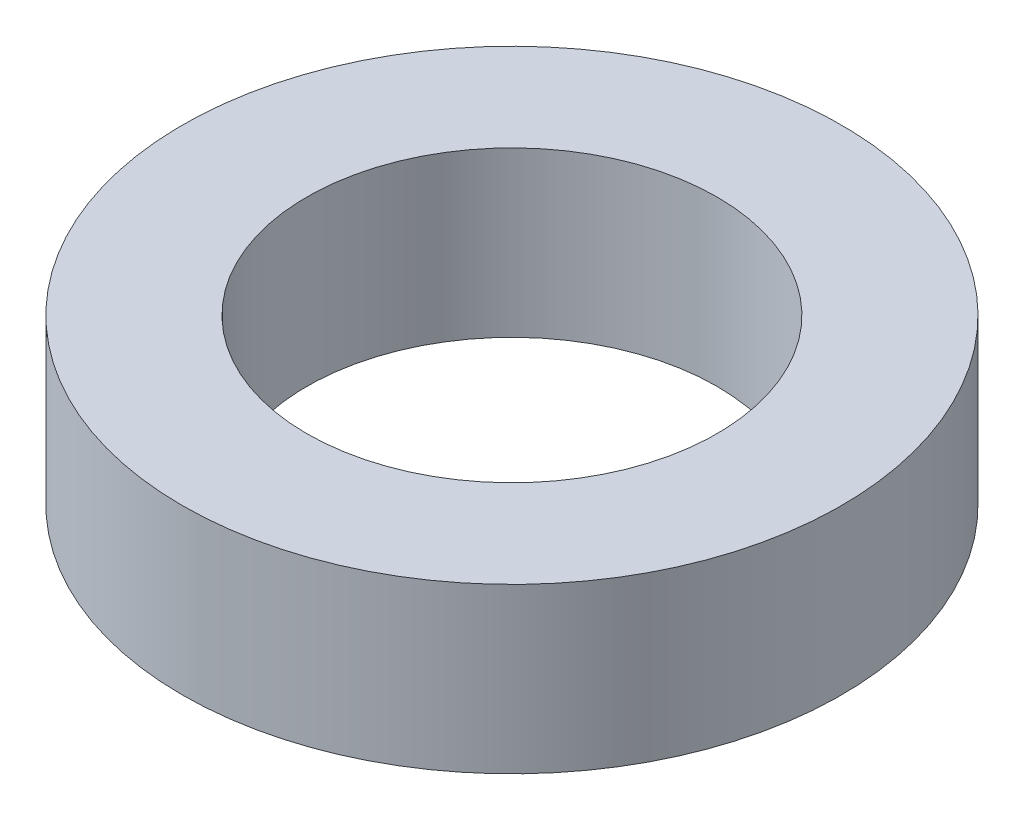
ISO-10303-21;
HEADER;
FILE_DESCRIPTION(('STEP AP214'),'2;1');
FILE_NAME('part.step','',(''),(''),'','','');
FILE_SCHEMA(('AUTOMOTIVE_DESIGN { 1 0 10303 214 1 1 1 1 }'));
ENDSEC;
DATA;
#1=APPLICATION_CONTEXT('core data for automotive mechanical design processes');
#2=APPLICATION_PROTOCOL_DEFINITION('international standard','automotive_design',2000,#1);
#3=PRODUCT_CONTEXT('',#1,'mechanical');
#4=PRODUCT('Part','Part','',(#3));
#5=PRODUCT_RELATED_PRODUCT_CATEGORY('part','',(#4));
#6=PRODUCT_DEFINITION_FORMATION('','',#4);
#7=PRODUCT_DEFINITION_CONTEXT('part definition',#1,'design');
#8=PRODUCT_DEFINITION('design','',#6,#7);
#9=PRODUCT_DEFINITION_SHAPE('','',#8);
#10=(LENGTH_UNIT() NAMED_UNIT(*) SI_UNIT(.MILLI.,.METRE.));
#11=(NAMED_UNIT(*) PLANE_ANGLE_UNIT() SI_UNIT($,.RADIAN.));
#12=(NAMED_UNIT(*) SI_UNIT($,.STERADIAN.) SOLID_ANGLE_UNIT());
#13=UNCERTAINTY_MEASURE_WITH_UNIT(LENGTH_MEASURE(1.E-05),#10,'distance_accuracy_value','');
#14=(GEOMETRIC_REPRESENTATION_CONTEXT(3) GLOBAL_UNCERTAINTY_ASSIGNED_CONTEXT((#13)) GLOBAL_UNIT_ASSIGNED_CONTEXT((#10,
#11,#12)) REPRESENTATION_CONTEXT('',''));
#15=CARTESIAN_POINT('',(0.,0.,0.));
#16=DIRECTION('',(0.,0.,1.));
#17=DIRECTION('',(1.,0.,0.));
#18=AXIS2_PLACEMENT_3D('',#15,#16,#17);
#19=CARTESIAN_POINT('',(0.,11.2,0.));
#20=DIRECTION('',(0.,1.,0.));
#21=DIRECTION('',(0.,0.,1.));
#22=AXIS2_PLACEMENT_3D('',#19,#20,#21);
#23=PLANE('',#22);
#24=CARTESIAN_POINT('',(0.,11.2,0.));
#25=DIRECTION('',(0.,1.,0.));
#26=DIRECTION('',(0.,0.,1.));
#27=AXIS2_PLACEMENT_3D('',#24,#25,#26);
#28=CIRCLE('',#27,22.5);
#29=CARTESIAN_POINT('',(0.,11.2,22.5));
#30=VERTEX_POINT('',#29);
#31=EDGE_CURVE('E10',#30,#30,#28,.T.);
#32=ORIENTED_EDGE('',*,*,#31,.T.);
#33=EDGE_LOOP('',(#32));
#34=FACE_BOUND('',#33,.T.);
#35=CARTESIAN_POINT('',(0.,11.2,0.));
#36=DIRECTION('',(0.,1.,0.));
#37=DIRECTION('',(0.,0.,1.));
#38=AXIS2_PLACEMENT_3D('',#35,#36,#37);
#39=CIRCLE('',#38,14.);
#40=CARTESIAN_POINT('',(0.,11.2,14.));
#41=VERTEX_POINT('',#40);
#42=EDGE_CURVE('E44',#41,#41,#39,.T.);
#43=ORIENTED_EDGE('',*,*,#42,.F.);
#44=EDGE_LOOP('',(#43));
#45=FACE_BOUND('',#44,.T.);
#46=ADVANCED_FACE('F33',(#34,#45),#23,.T.);
#47=CARTESIAN_POINT('',(0.,0.,0.));
#48=DIRECTION('',(0.,1.,0.));
#49=DIRECTION('',(0.,0.,1.));
#50=AXIS2_PLACEMENT_3D('',#47,#48,#49);
#51=PLANE('',#50);
#52=CARTESIAN_POINT('',(0.,0.,0.));
#53=DIRECTION('',(0.,1.,0.));
#54=DIRECTION('',(0.,0.,1.));
#55=AXIS2_PLACEMENT_3D('',#52,#53,#54);
#56=CIRCLE('',#55,22.5);
#57=CARTESIAN_POINT('',(0.,0.,22.5));
#58=VERTEX_POINT('',#57);
#59=EDGE_CURVE('E37',#58,#58,#56,.T.);
#60=ORIENTED_EDGE('',*,*,#59,.F.);
#61=EDGE_LOOP('',(#60));
#62=FACE_BOUND('',#61,.T.);
#63=CARTESIAN_POINT('',(0.,0.,0.));
#64=DIRECTION('',(0.,1.,0.));
#65=DIRECTION('',(0.,0.,1.));
#66=AXIS2_PLACEMENT_3D('',#63,#64,#65);
#67=CIRCLE('',#66,14.);
#68=CARTESIAN_POINT('',(0.,0.,14.));
#69=VERTEX_POINT('',#68);
#70=EDGE_CURVE('E46',#69,#69,#67,.T.);
#71=ORIENTED_EDGE('',*,*,#70,.T.);
#72=EDGE_LOOP('',(#71));
#73=FACE_BOUND('',#72,.T.);
#74=ADVANCED_FACE('F56',(#62,#73),#51,.F.);
#75=CARTESIAN_POINT('',(0.,11.2,0.));
#76=DIRECTION('',(0.,-1.,0.));
#77=DIRECTION('',(0.,0.,-1.));
#78=AXIS2_PLACEMENT_3D('',#75,#76,#77);
#79=CYLINDRICAL_SURFACE('',#78,22.5);
#80=ORIENTED_EDGE('',*,*,#31,.F.);
#81=EDGE_LOOP('',(#80));
#82=FACE_BOUND('',#81,.T.);
#83=ORIENTED_EDGE('',*,*,#59,.T.);
#84=EDGE_LOOP('',(#83));
#85=FACE_BOUND('',#84,.T.);
#86=ADVANCED_FACE('F35',(#82,#85),#79,.T.);
#87=CARTESIAN_POINT('',(0.,11.2,0.));
#88=DIRECTION('',(0.,-1.,0.));
#89=DIRECTION('',(0.,0.,-1.));
#90=AXIS2_PLACEMENT_3D('',#87,#88,#89);
#91=CYLINDRICAL_SURFACE('',#90,14.);
#92=ORIENTED_EDGE('',*,*,#42,.T.);
#93=EDGE_LOOP('',(#92));
#94=FACE_BOUND('',#93,.T.);
#95=ORIENTED_EDGE('',*,*,#70,.F.);
#96=EDGE_LOOP('',(#95));
#97=FACE_BOUND('',#96,.T.);
#98=ADVANCED_FACE('F52',(#94,#97),#91,.F.);
#99=CLOSED_SHELL('',(#46,#74,#86,#98));
#100=MANIFOLD_SOLID_BREP('B2',#99);
#101=ADVANCED_BREP_SHAPE_REPRESENTATION('',(#18,#100),#14);
#102=SHAPE_DEFINITION_REPRESENTATION(#9,#101);
ENDSEC;
END-ISO-10303-21;
